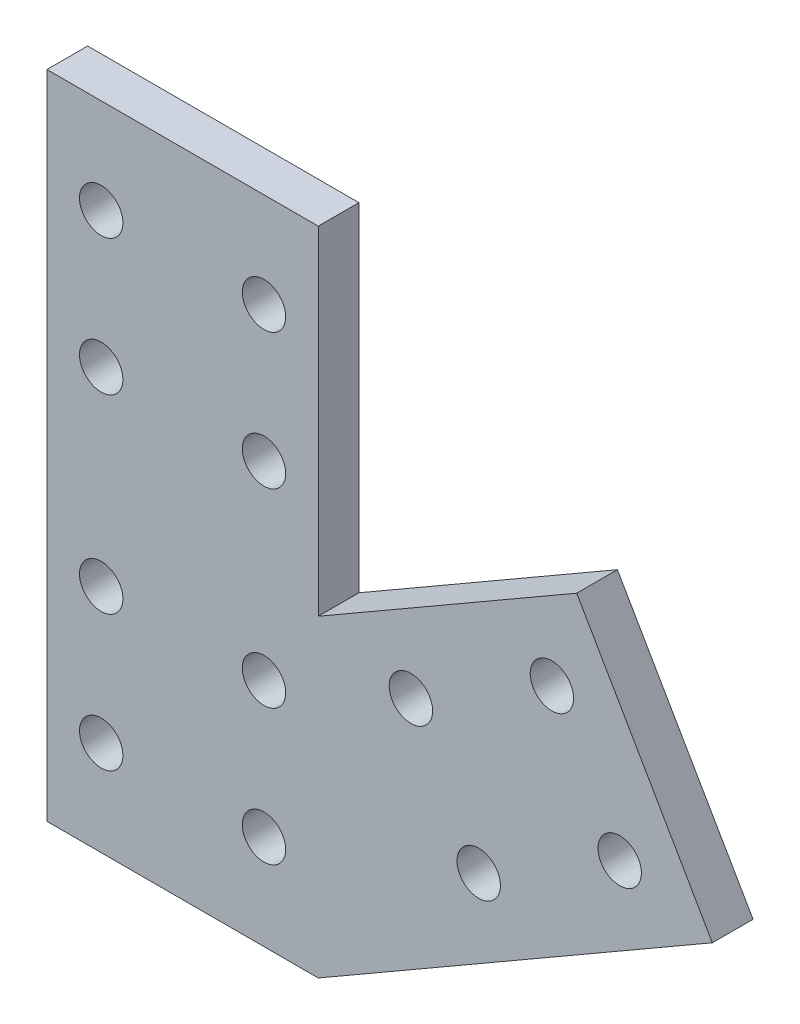
ISO-10303-21;
HEADER;
FILE_DESCRIPTION(('STEP AP214'),'2;1');
FILE_NAME('part.step','',(''),(''),'','','');
FILE_SCHEMA(('AUTOMOTIVE_DESIGN { 1 0 10303 214 1 1 1 1 }'));
ENDSEC;
DATA;
#1=APPLICATION_CONTEXT('core data for automotive mechanical design processes');
#2=APPLICATION_PROTOCOL_DEFINITION('international standard','automotive_design',2000,#1);
#3=PRODUCT_CONTEXT('',#1,'mechanical');
#4=PRODUCT('Part','Part','',(#3));
#5=PRODUCT_RELATED_PRODUCT_CATEGORY('part','',(#4));
#6=PRODUCT_DEFINITION_FORMATION('','',#4);
#7=PRODUCT_DEFINITION_CONTEXT('part definition',#1,'design');
#8=PRODUCT_DEFINITION('design','',#6,#7);
#9=PRODUCT_DEFINITION_SHAPE('','',#8);
#10=(LENGTH_UNIT() NAMED_UNIT(*) SI_UNIT(.MILLI.,.METRE.));
#11=(NAMED_UNIT(*) PLANE_ANGLE_UNIT() SI_UNIT($,.RADIAN.));
#12=(NAMED_UNIT(*) SI_UNIT($,.STERADIAN.) SOLID_ANGLE_UNIT());
#13=UNCERTAINTY_MEASURE_WITH_UNIT(LENGTH_MEASURE(1.E-05),#10,'distance_accuracy_value','');
#14=(GEOMETRIC_REPRESENTATION_CONTEXT(3) GLOBAL_UNCERTAINTY_ASSIGNED_CONTEXT((#13)) GLOBAL_UNIT_ASSIGNED_CONTEXT((#10,
#11,#12)) REPRESENTATION_CONTEXT('',''));
#15=CARTESIAN_POINT('',(0.,0.,0.));
#16=DIRECTION('',(0.,0.,1.));
#17=DIRECTION('',(1.,0.,0.));
#18=AXIS2_PLACEMENT_3D('',#15,#16,#17);
#19=CARTESIAN_POINT('',(0.,48.,3.));
#20=DIRECTION('',(0.,-1.,0.));
#21=DIRECTION('',(0.,0.,-1.));
#22=AXIS2_PLACEMENT_3D('',#19,#20,#21);
#23=PLANE('',#22);
#24=DIRECTION('',(-1.,0.,0.));
#25=VECTOR('',#24,1.);
#26=CARTESIAN_POINT('',(0.,48.,0.));
#27=LINE('',#26,#25);
#28=CARTESIAN_POINT('',(20.,48.,0.));
#29=VERTEX_POINT('',#28);
#30=CARTESIAN_POINT('',(0.,48.,0.));
#31=VERTEX_POINT('',#30);
#32=EDGE_CURVE('E125',#29,#31,#27,.T.);
#33=ORIENTED_EDGE('',*,*,#32,.T.);
#34=DIRECTION('',(0.,0.,-1.));
#35=VECTOR('',#34,1.);
#36=CARTESIAN_POINT('',(0.,48.,3.));
#37=LINE('',#36,#35);
#38=CARTESIAN_POINT('',(0.,48.,3.));
#39=VERTEX_POINT('',#38);
#40=EDGE_CURVE('E11',#39,#31,#37,.T.);
#41=ORIENTED_EDGE('',*,*,#40,.F.);
#42=DIRECTION('',(-1.,0.,0.));
#43=VECTOR('',#42,1.);
#44=CARTESIAN_POINT('',(0.,48.,3.));
#45=LINE('',#44,#43);
#46=CARTESIAN_POINT('',(20.,48.,3.));
#47=VERTEX_POINT('',#46);
#48=EDGE_CURVE('E138',#47,#39,#45,.T.);
#49=ORIENTED_EDGE('',*,*,#48,.F.);
#50=DIRECTION('',(0.,0.,-1.));
#51=VECTOR('',#50,1.);
#52=CARTESIAN_POINT('',(20.,48.,3.));
#53=LINE('',#52,#51);
#54=EDGE_CURVE('E121',#47,#29,#53,.T.);
#55=ORIENTED_EDGE('',*,*,#54,.T.);
#56=EDGE_LOOP('',(#33,#41,#49,#55));
#57=FACE_BOUND('',#56,.T.);
#58=ADVANCED_FACE('F35',(#57),#23,.F.);
#59=CARTESIAN_POINT('',(0.,48.,3.));
#60=DIRECTION('',(1.,0.,0.));
#61=DIRECTION('',(0.,1.,0.));
#62=AXIS2_PLACEMENT_3D('',#59,#60,#61);
#63=PLANE('',#62);
#64=DIRECTION('',(0.,-1.,0.));
#65=VECTOR('',#64,1.);
#66=CARTESIAN_POINT('',(0.,48.,0.));
#67=LINE('',#66,#65);
#68=CARTESIAN_POINT('',(0.,0.,0.));
#69=VERTEX_POINT('',#68);
#70=EDGE_CURVE('E128',#31,#69,#67,.T.);
#71=ORIENTED_EDGE('',*,*,#70,.T.);
#72=DIRECTION('',(0.,0.,-1.));
#73=VECTOR('',#72,1.);
#74=CARTESIAN_POINT('',(0.,0.,3.));
#75=LINE('',#74,#73);
#76=CARTESIAN_POINT('',(0.,0.,3.));
#77=VERTEX_POINT('',#76);
#78=EDGE_CURVE('E43',#77,#69,#75,.T.);
#79=ORIENTED_EDGE('',*,*,#78,.F.);
#80=DIRECTION('',(0.,-1.,0.));
#81=VECTOR('',#80,1.);
#82=CARTESIAN_POINT('',(0.,48.,3.));
#83=LINE('',#82,#81);
#84=EDGE_CURVE('E91',#39,#77,#83,.T.);
#85=ORIENTED_EDGE('',*,*,#84,.F.);
#86=ORIENTED_EDGE('',*,*,#40,.T.);
#87=EDGE_LOOP('',(#71,#79,#85,#86));
#88=FACE_BOUND('',#87,.T.);
#89=ADVANCED_FACE('F281',(#88),#63,.F.);
#90=CARTESIAN_POINT('',(20.,0.,3.));
#91=DIRECTION('',(0.,1.,0.));
#92=DIRECTION('',(-1.,0.,0.));
#93=AXIS2_PLACEMENT_3D('',#90,#91,#92);
#94=PLANE('',#93);
#95=DIRECTION('',(1.,0.,0.));
#96=VECTOR('',#95,1.);
#97=CARTESIAN_POINT('',(20.,0.,0.));
#98=LINE('',#97,#96);
#99=CARTESIAN_POINT('',(20.,0.,0.));
#100=VERTEX_POINT('',#99);
#101=EDGE_CURVE('E131',#69,#100,#98,.T.);
#102=ORIENTED_EDGE('',*,*,#101,.T.);
#103=DIRECTION('',(0.,0.,-1.));
#104=VECTOR('',#103,1.);
#105=CARTESIAN_POINT('',(20.,0.,3.));
#106=LINE('',#105,#104);
#107=CARTESIAN_POINT('',(20.,0.,3.));
#108=VERTEX_POINT('',#107);
#109=EDGE_CURVE('E142',#108,#100,#106,.T.);
#110=ORIENTED_EDGE('',*,*,#109,.F.);
#111=DIRECTION('',(1.,0.,0.));
#112=VECTOR('',#111,1.);
#113=CARTESIAN_POINT('',(20.,0.,3.));
#114=LINE('',#113,#112);
#115=EDGE_CURVE('E150',#77,#108,#114,.T.);
#116=ORIENTED_EDGE('',*,*,#115,.F.);
#117=ORIENTED_EDGE('',*,*,#78,.T.);
#118=EDGE_LOOP('',(#102,#110,#116,#117));
#119=FACE_BOUND('',#118,.T.);
#120=ADVANCED_FACE('F148',(#119),#94,.F.);
#121=CARTESIAN_POINT('',(49.0525588832582,16.7735026918971,3.));
#122=DIRECTION('',(-0.500000000000013,0.866025403784431,0.));
#123=DIRECTION('',(-0.866025403784431,-0.500000000000013,0.));
#124=AXIS2_PLACEMENT_3D('',#121,#122,#123);
#125=PLANE('',#124);
#126=DIRECTION('',(0.866025403784431,0.500000000000013,0.));
#127=VECTOR('',#126,1.);
#128=CARTESIAN_POINT('',(49.0525588832582,16.7735026918971,0.));
#129=LINE('',#128,#127);
#130=CARTESIAN_POINT('',(49.0525588832582,16.7735026918971,0.));
#131=VERTEX_POINT('',#130);
#132=EDGE_CURVE('E133',#100,#131,#129,.T.);
#133=ORIENTED_EDGE('',*,*,#132,.T.);
#134=DIRECTION('',(0.,0.,-1.));
#135=VECTOR('',#134,1.);
#136=CARTESIAN_POINT('',(49.0525588832582,16.7735026918971,3.));
#137=LINE('',#136,#135);
#138=CARTESIAN_POINT('',(49.0525588832582,16.7735026918971,3.));
#139=VERTEX_POINT('',#138);
#140=EDGE_CURVE('E116',#139,#131,#137,.T.);
#141=ORIENTED_EDGE('',*,*,#140,.F.);
#142=DIRECTION('',(0.866025403784431,0.500000000000013,0.));
#143=VECTOR('',#142,1.);
#144=CARTESIAN_POINT('',(49.0525588832582,16.7735026918971,3.));
#145=LINE('',#144,#143);
#146=EDGE_CURVE('E107',#108,#139,#145,.T.);
#147=ORIENTED_EDGE('',*,*,#146,.F.);
#148=ORIENTED_EDGE('',*,*,#109,.T.);
#149=EDGE_LOOP('',(#133,#141,#147,#148));
#150=FACE_BOUND('',#149,.T.);
#151=ADVANCED_FACE('F156',(#150),#125,.F.);
#152=CARTESIAN_POINT('',(39.0525588832576,34.0940107675856,3.));
#153=DIRECTION('',(-0.866025403784422,-0.500000000000028,0.));
#154=DIRECTION('',(0.500000000000028,-0.866025403784422,0.));
#155=AXIS2_PLACEMENT_3D('',#152,#153,#154);
#156=PLANE('',#155);
#157=DIRECTION('',(-0.500000000000028,0.866025403784422,0.));
#158=VECTOR('',#157,1.);
#159=CARTESIAN_POINT('',(39.0525588832576,34.0940107675856,0.));
#160=LINE('',#159,#158);
#161=CARTESIAN_POINT('',(39.0525588832576,34.0940107675856,0.));
#162=VERTEX_POINT('',#161);
#163=EDGE_CURVE('E115',#131,#162,#160,.T.);
#164=ORIENTED_EDGE('',*,*,#163,.T.);
#165=DIRECTION('',(0.,0.,-1.));
#166=VECTOR('',#165,1.);
#167=CARTESIAN_POINT('',(39.0525588832576,34.0940107675856,3.));
#168=LINE('',#167,#166);
#169=CARTESIAN_POINT('',(39.0525588832576,34.0940107675856,3.));
#170=VERTEX_POINT('',#169);
#171=EDGE_CURVE('E112',#170,#162,#168,.T.);
#172=ORIENTED_EDGE('',*,*,#171,.F.);
#173=DIRECTION('',(-0.500000000000028,0.866025403784422,0.));
#174=VECTOR('',#173,1.);
#175=CARTESIAN_POINT('',(39.0525588832576,34.0940107675856,3.));
#176=LINE('',#175,#174);
#177=EDGE_CURVE('E101',#139,#170,#176,.T.);
#178=ORIENTED_EDGE('',*,*,#177,.F.);
#179=ORIENTED_EDGE('',*,*,#140,.T.);
#180=EDGE_LOOP('',(#164,#172,#178,#179));
#181=FACE_BOUND('',#180,.T.);
#182=ADVANCED_FACE('F113',(#181),#156,.F.);
#183=CARTESIAN_POINT('',(20.,23.0940107675855,3.));
#184=DIRECTION('',(0.500000000000004,-0.866025403784436,0.));
#185=DIRECTION('',(0.866025403784436,0.500000000000004,0.));
#186=AXIS2_PLACEMENT_3D('',#183,#184,#185);
#187=PLANE('',#186);
#188=DIRECTION('',(-0.866025403784436,-0.500000000000004,0.));
#189=VECTOR('',#188,1.);
#190=CARTESIAN_POINT('',(20.,23.0940107675855,0.));
#191=LINE('',#190,#189);
#192=CARTESIAN_POINT('',(20.,23.0940107675855,0.));
#193=VERTEX_POINT('',#192);
#194=EDGE_CURVE('E77',#162,#193,#191,.T.);
#195=ORIENTED_EDGE('',*,*,#194,.T.);
#196=DIRECTION('',(0.,0.,-1.));
#197=VECTOR('',#196,1.);
#198=CARTESIAN_POINT('',(20.,23.0940107675855,3.));
#199=LINE('',#198,#197);
#200=CARTESIAN_POINT('',(20.,23.0940107675855,3.));
#201=VERTEX_POINT('',#200);
#202=EDGE_CURVE('E117',#201,#193,#199,.T.);
#203=ORIENTED_EDGE('',*,*,#202,.F.);
#204=DIRECTION('',(-0.866025403784436,-0.500000000000004,0.));
#205=VECTOR('',#204,1.);
#206=CARTESIAN_POINT('',(20.,23.0940107675855,3.));
#207=LINE('',#206,#205);
#208=EDGE_CURVE('E105',#170,#201,#207,.T.);
#209=ORIENTED_EDGE('',*,*,#208,.F.);
#210=ORIENTED_EDGE('',*,*,#171,.T.);
#211=EDGE_LOOP('',(#195,#203,#209,#210));
#212=FACE_BOUND('',#211,.T.);
#213=ADVANCED_FACE('F119',(#212),#187,.F.);
#214=CARTESIAN_POINT('',(20.,48.,3.));
#215=DIRECTION('',(-1.,0.,0.));
#216=DIRECTION('',(0.,-1.,0.));
#217=AXIS2_PLACEMENT_3D('',#214,#215,#216);
#218=PLANE('',#217);
#219=DIRECTION('',(0.,1.,0.));
#220=VECTOR('',#219,1.);
#221=CARTESIAN_POINT('',(20.,48.,0.));
#222=LINE('',#221,#220);
#223=EDGE_CURVE('E83',#193,#29,#222,.T.);
#224=ORIENTED_EDGE('',*,*,#223,.T.);
#225=ORIENTED_EDGE('',*,*,#54,.F.);
#226=DIRECTION('',(0.,1.,0.));
#227=VECTOR('',#226,1.);
#228=CARTESIAN_POINT('',(20.,48.,3.));
#229=LINE('',#228,#227);
#230=EDGE_CURVE('E51',#201,#47,#229,.T.);
#231=ORIENTED_EDGE('',*,*,#230,.F.);
#232=ORIENTED_EDGE('',*,*,#202,.T.);
#233=EDGE_LOOP('',(#224,#225,#231,#232));
#234=FACE_BOUND('',#233,.T.);
#235=ADVANCED_FACE('F288',(#234),#218,.F.);
#236=CARTESIAN_POINT('',(0.,0.,3.));
#237=DIRECTION('',(0.,0.,-1.));
#238=DIRECTION('',(-1.,0.,0.));
#239=AXIS2_PLACEMENT_3D('',#236,#237,#238);
#240=PLANE('',#239);
#241=CARTESIAN_POINT('',(42.222431864336,18.6036297108193,3.));
#242=DIRECTION('',(0.,0.,-1.));
#243=DIRECTION('',(-1.,0.,0.));
#244=AXIS2_PLACEMENT_3D('',#241,#242,#243);
#245=CIRCLE('',#244,1.6);
#246=CARTESIAN_POINT('',(40.622431864336,18.6036297108193,3.));
#247=VERTEX_POINT('',#246);
#248=EDGE_CURVE('E129',#247,#247,#245,.T.);
#249=ORIENTED_EDGE('',*,*,#248,.T.);
#250=EDGE_LOOP('',(#249));
#251=FACE_BOUND('',#250,.T.);
#252=CARTESIAN_POINT('',(16.,41.,3.));
#253=DIRECTION('',(0.,0.,-1.));
#254=DIRECTION('',(-1.,0.,0.));
#255=AXIS2_PLACEMENT_3D('',#252,#253,#254);
#256=CIRCLE('',#255,1.6);
#257=CARTESIAN_POINT('',(14.4,41.,3.));
#258=VERTEX_POINT('',#257);
#259=EDGE_CURVE('E203',#258,#258,#256,.T.);
#260=ORIENTED_EDGE('',*,*,#259,.T.);
#261=EDGE_LOOP('',(#260));
#262=FACE_BOUND('',#261,.T.);
#263=CARTESIAN_POINT('',(4.,31.,3.));
#264=DIRECTION('',(0.,0.,-1.));
#265=DIRECTION('',(-1.,0.,0.));
#266=AXIS2_PLACEMENT_3D('',#263,#264,#265);
#267=CIRCLE('',#266,1.6);
#268=CARTESIAN_POINT('',(2.4,31.,3.));
#269=VERTEX_POINT('',#268);
#270=EDGE_CURVE('E214',#269,#269,#267,.T.);
#271=ORIENTED_EDGE('',*,*,#270,.T.);
#272=EDGE_LOOP('',(#271));
#273=FACE_BOUND('',#272,.T.);
#274=CARTESIAN_POINT('',(4.,41.,3.));
#275=DIRECTION('',(0.,0.,-1.));
#276=DIRECTION('',(-1.,0.,0.));
#277=AXIS2_PLACEMENT_3D('',#274,#275,#276);
#278=CIRCLE('',#277,1.6);
#279=CARTESIAN_POINT('',(2.4,41.,3.));
#280=VERTEX_POINT('',#279);
#281=EDGE_CURVE('E215',#280,#280,#278,.T.);
#282=ORIENTED_EDGE('',*,*,#281,.T.);
#283=EDGE_LOOP('',(#282));
#284=FACE_BOUND('',#283,.T.);
#285=CARTESIAN_POINT('',(37.222431864336,27.2638837486637,3.));
#286=DIRECTION('',(0.,0.,-1.));
#287=DIRECTION('',(-1.,0.,0.));
#288=AXIS2_PLACEMENT_3D('',#285,#286,#287);
#289=CIRCLE('',#288,1.6);
#290=CARTESIAN_POINT('',(35.622431864336,27.2638837486637,3.));
#291=VERTEX_POINT('',#290);
#292=EDGE_CURVE('E183',#291,#291,#289,.T.);
#293=ORIENTED_EDGE('',*,*,#292,.T.);
#294=EDGE_LOOP('',(#293));
#295=FACE_BOUND('',#294,.T.);
#296=CARTESIAN_POINT('',(26.8301270189227,21.2638837486637,3.));
#297=DIRECTION('',(0.,0.,-1.));
#298=DIRECTION('',(-1.,0.,0.));
#299=AXIS2_PLACEMENT_3D('',#296,#297,#298);
#300=CIRCLE('',#299,1.6);
#301=CARTESIAN_POINT('',(25.2301270189227,21.2638837486637,3.));
#302=VERTEX_POINT('',#301);
#303=EDGE_CURVE('E177',#302,#302,#300,.T.);
#304=ORIENTED_EDGE('',*,*,#303,.T.);
#305=EDGE_LOOP('',(#304));
#306=FACE_BOUND('',#305,.T.);
#307=CARTESIAN_POINT('',(31.8301270189227,12.6036297108193,3.));
#308=DIRECTION('',(0.,0.,-1.));
#309=DIRECTION('',(-1.,0.,0.));
#310=AXIS2_PLACEMENT_3D('',#307,#308,#309);
#311=CIRCLE('',#310,1.6);
#312=CARTESIAN_POINT('',(30.2301270189227,12.6036297108193,3.));
#313=VERTEX_POINT('',#312);
#314=EDGE_CURVE('E171',#313,#313,#311,.T.);
#315=ORIENTED_EDGE('',*,*,#314,.T.);
#316=EDGE_LOOP('',(#315));
#317=FACE_BOUND('',#316,.T.);
#318=CARTESIAN_POINT('',(16.,7.,3.));
#319=DIRECTION('',(0.,0.,-1.));
#320=DIRECTION('',(-1.,0.,0.));
#321=AXIS2_PLACEMENT_3D('',#318,#319,#320);
#322=CIRCLE('',#321,1.6);
#323=CARTESIAN_POINT('',(14.4,7.,3.));
#324=VERTEX_POINT('',#323);
#325=EDGE_CURVE('E164',#324,#324,#322,.T.);
#326=ORIENTED_EDGE('',*,*,#325,.T.);
#327=EDGE_LOOP('',(#326));
#328=FACE_BOUND('',#327,.T.);
#329=CARTESIAN_POINT('',(16.,31.,3.));
#330=DIRECTION('',(0.,0.,-1.));
#331=DIRECTION('',(-1.,0.,0.));
#332=AXIS2_PLACEMENT_3D('',#329,#330,#331);
#333=CIRCLE('',#332,1.6);
#334=CARTESIAN_POINT('',(14.4,31.,3.));
#335=VERTEX_POINT('',#334);
#336=EDGE_CURVE('E202',#335,#335,#333,.T.);
#337=ORIENTED_EDGE('',*,*,#336,.T.);
#338=EDGE_LOOP('',(#337));
#339=FACE_BOUND('',#338,.T.);
#340=CARTESIAN_POINT('',(4.,17.,3.));
#341=DIRECTION('',(0.,0.,-1.));
#342=DIRECTION('',(-1.,0.,0.));
#343=AXIS2_PLACEMENT_3D('',#340,#341,#342);
#344=CIRCLE('',#343,1.6);
#345=CARTESIAN_POINT('',(2.4,17.,3.));
#346=VERTEX_POINT('',#345);
#347=EDGE_CURVE('E191',#346,#346,#344,.T.);
#348=ORIENTED_EDGE('',*,*,#347,.T.);
#349=EDGE_LOOP('',(#348));
#350=FACE_BOUND('',#349,.T.);
#351=CARTESIAN_POINT('',(4.,7.,3.));
#352=DIRECTION('',(0.,0.,-1.));
#353=DIRECTION('',(-1.,0.,0.));
#354=AXIS2_PLACEMENT_3D('',#351,#352,#353);
#355=CIRCLE('',#354,1.6);
#356=CARTESIAN_POINT('',(2.4,7.,3.));
#357=VERTEX_POINT('',#356);
#358=EDGE_CURVE('E190',#357,#357,#355,.T.);
#359=ORIENTED_EDGE('',*,*,#358,.T.);
#360=EDGE_LOOP('',(#359));
#361=FACE_BOUND('',#360,.T.);
#362=CARTESIAN_POINT('',(16.,17.,3.));
#363=DIRECTION('',(0.,0.,-1.));
#364=DIRECTION('',(-1.,0.,0.));
#365=AXIS2_PLACEMENT_3D('',#362,#363,#364);
#366=CIRCLE('',#365,1.6);
#367=CARTESIAN_POINT('',(14.4,17.,3.));
#368=VERTEX_POINT('',#367);
#369=EDGE_CURVE('E165',#368,#368,#366,.T.);
#370=ORIENTED_EDGE('',*,*,#369,.T.);
#371=EDGE_LOOP('',(#370));
#372=FACE_BOUND('',#371,.T.);
#373=ORIENTED_EDGE('',*,*,#48,.T.);
#374=ORIENTED_EDGE('',*,*,#84,.T.);
#375=ORIENTED_EDGE('',*,*,#115,.T.);
#376=ORIENTED_EDGE('',*,*,#146,.T.);
#377=ORIENTED_EDGE('',*,*,#177,.T.);
#378=ORIENTED_EDGE('',*,*,#208,.T.);
#379=ORIENTED_EDGE('',*,*,#230,.T.);
#380=EDGE_LOOP('',(#373,#374,#375,#376,#377,#378,#379));
#381=FACE_BOUND('',#380,.T.);
#382=ADVANCED_FACE('F103',(#251,#262,#273,#284,#295,#306,#317,#328,#339,#350,#361,#372,#381),
#240,.F.);
#383=CARTESIAN_POINT('',(0.,0.,0.));
#384=DIRECTION('',(0.,0.,-1.));
#385=DIRECTION('',(-1.,0.,0.));
#386=AXIS2_PLACEMENT_3D('',#383,#384,#385);
#387=PLANE('',#386);
#388=CARTESIAN_POINT('',(42.222431864336,18.6036297108193,0.));
#389=DIRECTION('',(0.,0.,-1.));
#390=DIRECTION('',(-1.,0.,0.));
#391=AXIS2_PLACEMENT_3D('',#388,#389,#390);
#392=CIRCLE('',#391,1.6);
#393=CARTESIAN_POINT('',(40.622431864336,18.6036297108193,0.));
#394=VERTEX_POINT('',#393);
#395=EDGE_CURVE('E186',#394,#394,#392,.T.);
#396=ORIENTED_EDGE('',*,*,#395,.F.);
#397=EDGE_LOOP('',(#396));
#398=FACE_BOUND('',#397,.T.);
#399=CARTESIAN_POINT('',(16.,41.,0.));
#400=DIRECTION('',(0.,0.,-1.));
#401=DIRECTION('',(-1.,0.,0.));
#402=AXIS2_PLACEMENT_3D('',#399,#400,#401);
#403=CIRCLE('',#402,1.6);
#404=CARTESIAN_POINT('',(14.4,41.,0.));
#405=VERTEX_POINT('',#404);
#406=EDGE_CURVE('E218',#405,#405,#403,.T.);
#407=ORIENTED_EDGE('',*,*,#406,.F.);
#408=EDGE_LOOP('',(#407));
#409=FACE_BOUND('',#408,.T.);
#410=CARTESIAN_POINT('',(4.,31.,0.));
#411=DIRECTION('',(0.,0.,-1.));
#412=DIRECTION('',(-1.,0.,0.));
#413=AXIS2_PLACEMENT_3D('',#410,#411,#412);
#414=CIRCLE('',#413,1.6);
#415=CARTESIAN_POINT('',(2.4,31.,0.));
#416=VERTEX_POINT('',#415);
#417=EDGE_CURVE('E211',#416,#416,#414,.T.);
#418=ORIENTED_EDGE('',*,*,#417,.F.);
#419=EDGE_LOOP('',(#418));
#420=FACE_BOUND('',#419,.T.);
#421=CARTESIAN_POINT('',(4.,41.,0.));
#422=DIRECTION('',(0.,0.,-1.));
#423=DIRECTION('',(-1.,0.,0.));
#424=AXIS2_PLACEMENT_3D('',#421,#422,#423);
#425=CIRCLE('',#424,1.6);
#426=CARTESIAN_POINT('',(2.4,41.,0.));
#427=VERTEX_POINT('',#426);
#428=EDGE_CURVE('E223',#427,#427,#425,.T.);
#429=ORIENTED_EDGE('',*,*,#428,.F.);
#430=EDGE_LOOP('',(#429));
#431=FACE_BOUND('',#430,.T.);
#432=CARTESIAN_POINT('',(37.222431864336,27.2638837486637,0.));
#433=DIRECTION('',(0.,0.,-1.));
#434=DIRECTION('',(-1.,0.,0.));
#435=AXIS2_PLACEMENT_3D('',#432,#433,#434);
#436=CIRCLE('',#435,1.6);
#437=CARTESIAN_POINT('',(35.622431864336,27.2638837486637,0.));
#438=VERTEX_POINT('',#437);
#439=EDGE_CURVE('E180',#438,#438,#436,.T.);
#440=ORIENTED_EDGE('',*,*,#439,.F.);
#441=EDGE_LOOP('',(#440));
#442=FACE_BOUND('',#441,.T.);
#443=CARTESIAN_POINT('',(26.8301270189227,21.2638837486637,0.));
#444=DIRECTION('',(0.,0.,-1.));
#445=DIRECTION('',(-1.,0.,0.));
#446=AXIS2_PLACEMENT_3D('',#443,#444,#445);
#447=CIRCLE('',#446,1.6);
#448=CARTESIAN_POINT('',(25.2301270189227,21.2638837486637,0.));
#449=VERTEX_POINT('',#448);
#450=EDGE_CURVE('E174',#449,#449,#447,.T.);
#451=ORIENTED_EDGE('',*,*,#450,.F.);
#452=EDGE_LOOP('',(#451));
#453=FACE_BOUND('',#452,.T.);
#454=CARTESIAN_POINT('',(31.8301270189227,12.6036297108193,0.));
#455=DIRECTION('',(0.,0.,-1.));
#456=DIRECTION('',(-1.,0.,0.));
#457=AXIS2_PLACEMENT_3D('',#454,#455,#456);
#458=CIRCLE('',#457,1.6);
#459=CARTESIAN_POINT('',(30.2301270189227,12.6036297108193,0.));
#460=VERTEX_POINT('',#459);
#461=EDGE_CURVE('E168',#460,#460,#458,.T.);
#462=ORIENTED_EDGE('',*,*,#461,.F.);
#463=EDGE_LOOP('',(#462));
#464=FACE_BOUND('',#463,.T.);
#465=CARTESIAN_POINT('',(16.,7.,0.));
#466=DIRECTION('',(0.,0.,-1.));
#467=DIRECTION('',(-1.,0.,0.));
#468=AXIS2_PLACEMENT_3D('',#465,#466,#467);
#469=CIRCLE('',#468,1.6);
#470=CARTESIAN_POINT('',(14.4,7.,0.));
#471=VERTEX_POINT('',#470);
#472=EDGE_CURVE('E161',#471,#471,#469,.T.);
#473=ORIENTED_EDGE('',*,*,#472,.F.);
#474=EDGE_LOOP('',(#473));
#475=FACE_BOUND('',#474,.T.);
#476=CARTESIAN_POINT('',(16.,31.,0.));
#477=DIRECTION('',(0.,0.,-1.));
#478=DIRECTION('',(-1.,0.,0.));
#479=AXIS2_PLACEMENT_3D('',#476,#477,#478);
#480=CIRCLE('',#479,1.6);
#481=CARTESIAN_POINT('',(14.4,31.,0.));
#482=VERTEX_POINT('',#481);
#483=EDGE_CURVE('E199',#482,#482,#480,.T.);
#484=ORIENTED_EDGE('',*,*,#483,.F.);
#485=EDGE_LOOP('',(#484));
#486=FACE_BOUND('',#485,.T.);
#487=CARTESIAN_POINT('',(4.,17.,0.));
#488=DIRECTION('',(0.,0.,-1.));
#489=DIRECTION('',(-1.,0.,0.));
#490=AXIS2_PLACEMENT_3D('',#487,#488,#489);
#491=CIRCLE('',#490,1.6);
#492=CARTESIAN_POINT('',(2.4,17.,0.));
#493=VERTEX_POINT('',#492);
#494=EDGE_CURVE('E206',#493,#493,#491,.T.);
#495=ORIENTED_EDGE('',*,*,#494,.F.);
#496=EDGE_LOOP('',(#495));
#497=FACE_BOUND('',#496,.T.);
#498=CARTESIAN_POINT('',(4.,7.,0.));
#499=DIRECTION('',(0.,0.,-1.));
#500=DIRECTION('',(-1.,0.,0.));
#501=AXIS2_PLACEMENT_3D('',#498,#499,#500);
#502=CIRCLE('',#501,1.6);
#503=CARTESIAN_POINT('',(2.4,7.,0.));
#504=VERTEX_POINT('',#503);
#505=EDGE_CURVE('E187',#504,#504,#502,.T.);
#506=ORIENTED_EDGE('',*,*,#505,.F.);
#507=EDGE_LOOP('',(#506));
#508=FACE_BOUND('',#507,.T.);
#509=CARTESIAN_POINT('',(16.,17.,0.));
#510=DIRECTION('',(0.,0.,-1.));
#511=DIRECTION('',(-1.,0.,0.));
#512=AXIS2_PLACEMENT_3D('',#509,#510,#511);
#513=CIRCLE('',#512,1.6);
#514=CARTESIAN_POINT('',(14.4,17.,0.));
#515=VERTEX_POINT('',#514);
#516=EDGE_CURVE('E194',#515,#515,#513,.T.);
#517=ORIENTED_EDGE('',*,*,#516,.F.);
#518=EDGE_LOOP('',(#517));
#519=FACE_BOUND('',#518,.T.);
#520=ORIENTED_EDGE('',*,*,#32,.F.);
#521=ORIENTED_EDGE('',*,*,#223,.F.);
#522=ORIENTED_EDGE('',*,*,#194,.F.);
#523=ORIENTED_EDGE('',*,*,#163,.F.);
#524=ORIENTED_EDGE('',*,*,#132,.F.);
#525=ORIENTED_EDGE('',*,*,#101,.F.);
#526=ORIENTED_EDGE('',*,*,#70,.F.);
#527=EDGE_LOOP('',(#520,#521,#522,#523,#524,#525,#526));
#528=FACE_BOUND('',#527,.T.);
#529=ADVANCED_FACE('F154',(#398,#409,#420,#431,#442,#453,#464,#475,#486,#497,#508,#519,#528),
#387,.T.);
#530=CARTESIAN_POINT('',(16.,17.,3.));
#531=DIRECTION('',(0.,0.,-1.));
#532=DIRECTION('',(-1.,0.,0.));
#533=AXIS2_PLACEMENT_3D('',#530,#531,#532);
#534=CYLINDRICAL_SURFACE('',#533,1.6);
#535=ORIENTED_EDGE('',*,*,#369,.F.);
#536=EDGE_LOOP('',(#535));
#537=FACE_BOUND('',#536,.T.);
#538=ORIENTED_EDGE('',*,*,#516,.T.);
#539=EDGE_LOOP('',(#538));
#540=FACE_BOUND('',#539,.T.);
#541=ADVANCED_FACE('F244',(#537,#540),#534,.F.);
#542=CARTESIAN_POINT('',(4.,7.,3.));
#543=DIRECTION('',(0.,0.,-1.));
#544=DIRECTION('',(-1.,0.,0.));
#545=AXIS2_PLACEMENT_3D('',#542,#543,#544);
#546=CYLINDRICAL_SURFACE('',#545,1.6);
#547=ORIENTED_EDGE('',*,*,#358,.F.);
#548=EDGE_LOOP('',(#547));
#549=FACE_BOUND('',#548,.T.);
#550=ORIENTED_EDGE('',*,*,#505,.T.);
#551=EDGE_LOOP('',(#550));
#552=FACE_BOUND('',#551,.T.);
#553=ADVANCED_FACE('F269',(#549,#552),#546,.F.);
#554=CARTESIAN_POINT('',(4.,17.,3.));
#555=DIRECTION('',(0.,0.,-1.));
#556=DIRECTION('',(-1.,0.,0.));
#557=AXIS2_PLACEMENT_3D('',#554,#555,#556);
#558=CYLINDRICAL_SURFACE('',#557,1.6);
#559=ORIENTED_EDGE('',*,*,#347,.F.);
#560=EDGE_LOOP('',(#559));
#561=FACE_BOUND('',#560,.T.);
#562=ORIENTED_EDGE('',*,*,#494,.T.);
#563=EDGE_LOOP('',(#562));
#564=FACE_BOUND('',#563,.T.);
#565=ADVANCED_FACE('F275',(#561,#564),#558,.F.);
#566=CARTESIAN_POINT('',(16.,31.,3.));
#567=DIRECTION('',(0.,0.,-1.));
#568=DIRECTION('',(-1.,0.,0.));
#569=AXIS2_PLACEMENT_3D('',#566,#567,#568);
#570=CYLINDRICAL_SURFACE('',#569,1.6);
#571=ORIENTED_EDGE('',*,*,#336,.F.);
#572=EDGE_LOOP('',(#571));
#573=FACE_BOUND('',#572,.T.);
#574=ORIENTED_EDGE('',*,*,#483,.T.);
#575=EDGE_LOOP('',(#574));
#576=FACE_BOUND('',#575,.T.);
#577=ADVANCED_FACE('F354',(#573,#576),#570,.F.);
#578=CARTESIAN_POINT('',(16.,7.,3.));
#579=DIRECTION('',(0.,0.,-1.));
#580=DIRECTION('',(-1.,0.,0.));
#581=AXIS2_PLACEMENT_3D('',#578,#579,#580);
#582=CYLINDRICAL_SURFACE('',#581,1.6);
#583=ORIENTED_EDGE('',*,*,#325,.F.);
#584=EDGE_LOOP('',(#583));
#585=FACE_BOUND('',#584,.T.);
#586=ORIENTED_EDGE('',*,*,#472,.T.);
#587=EDGE_LOOP('',(#586));
#588=FACE_BOUND('',#587,.T.);
#589=ADVANCED_FACE('F364',(#585,#588),#582,.F.);
#590=CARTESIAN_POINT('',(31.8301270189227,12.6036297108193,3.));
#591=DIRECTION('',(0.,0.,-1.));
#592=DIRECTION('',(-1.,0.,0.));
#593=AXIS2_PLACEMENT_3D('',#590,#591,#592);
#594=CYLINDRICAL_SURFACE('',#593,1.6);
#595=ORIENTED_EDGE('',*,*,#314,.F.);
#596=EDGE_LOOP('',(#595));
#597=FACE_BOUND('',#596,.T.);
#598=ORIENTED_EDGE('',*,*,#461,.T.);
#599=EDGE_LOOP('',(#598));
#600=FACE_BOUND('',#599,.T.);
#601=ADVANCED_FACE('F373',(#597,#600),#594,.F.);
#602=CARTESIAN_POINT('',(26.8301270189227,21.2638837486637,3.));
#603=DIRECTION('',(0.,0.,-1.));
#604=DIRECTION('',(-1.,0.,0.));
#605=AXIS2_PLACEMENT_3D('',#602,#603,#604);
#606=CYLINDRICAL_SURFACE('',#605,1.6);
#607=ORIENTED_EDGE('',*,*,#303,.F.);
#608=EDGE_LOOP('',(#607));
#609=FACE_BOUND('',#608,.T.);
#610=ORIENTED_EDGE('',*,*,#450,.T.);
#611=EDGE_LOOP('',(#610));
#612=FACE_BOUND('',#611,.T.);
#613=ADVANCED_FACE('F383',(#609,#612),#606,.F.);
#614=CARTESIAN_POINT('',(37.222431864336,27.2638837486637,3.));
#615=DIRECTION('',(0.,0.,-1.));
#616=DIRECTION('',(-1.,0.,0.));
#617=AXIS2_PLACEMENT_3D('',#614,#615,#616);
#618=CYLINDRICAL_SURFACE('',#617,1.6);
#619=ORIENTED_EDGE('',*,*,#292,.F.);
#620=EDGE_LOOP('',(#619));
#621=FACE_BOUND('',#620,.T.);
#622=ORIENTED_EDGE('',*,*,#439,.T.);
#623=EDGE_LOOP('',(#622));
#624=FACE_BOUND('',#623,.T.);
#625=ADVANCED_FACE('F393',(#621,#624),#618,.F.);
#626=CARTESIAN_POINT('',(4.,41.,3.));
#627=DIRECTION('',(0.,0.,-1.));
#628=DIRECTION('',(-1.,0.,0.));
#629=AXIS2_PLACEMENT_3D('',#626,#627,#628);
#630=CYLINDRICAL_SURFACE('',#629,1.6);
#631=ORIENTED_EDGE('',*,*,#281,.F.);
#632=EDGE_LOOP('',(#631));
#633=FACE_BOUND('',#632,.T.);
#634=ORIENTED_EDGE('',*,*,#428,.T.);
#635=EDGE_LOOP('',(#634));
#636=FACE_BOUND('',#635,.T.);
#637=ADVANCED_FACE('F403',(#633,#636),#630,.F.);
#638=CARTESIAN_POINT('',(4.,31.,3.));
#639=DIRECTION('',(0.,0.,-1.));
#640=DIRECTION('',(-1.,0.,0.));
#641=AXIS2_PLACEMENT_3D('',#638,#639,#640);
#642=CYLINDRICAL_SURFACE('',#641,1.6);
#643=ORIENTED_EDGE('',*,*,#270,.F.);
#644=EDGE_LOOP('',(#643));
#645=FACE_BOUND('',#644,.T.);
#646=ORIENTED_EDGE('',*,*,#417,.T.);
#647=EDGE_LOOP('',(#646));
#648=FACE_BOUND('',#647,.T.);
#649=ADVANCED_FACE('F413',(#645,#648),#642,.F.);
#650=CARTESIAN_POINT('',(16.,41.,3.));
#651=DIRECTION('',(0.,0.,-1.));
#652=DIRECTION('',(-1.,0.,0.));
#653=AXIS2_PLACEMENT_3D('',#650,#651,#652);
#654=CYLINDRICAL_SURFACE('',#653,1.6);
#655=ORIENTED_EDGE('',*,*,#259,.F.);
#656=EDGE_LOOP('',(#655));
#657=FACE_BOUND('',#656,.T.);
#658=ORIENTED_EDGE('',*,*,#406,.T.);
#659=EDGE_LOOP('',(#658));
#660=FACE_BOUND('',#659,.T.);
#661=ADVANCED_FACE('F238',(#657,#660),#654,.F.);
#662=CARTESIAN_POINT('',(42.222431864336,18.6036297108193,3.));
#663=DIRECTION('',(0.,0.,-1.));
#664=DIRECTION('',(-1.,0.,0.));
#665=AXIS2_PLACEMENT_3D('',#662,#663,#664);
#666=CYLINDRICAL_SURFACE('',#665,1.6);
#667=ORIENTED_EDGE('',*,*,#248,.F.);
#668=EDGE_LOOP('',(#667));
#669=FACE_BOUND('',#668,.T.);
#670=ORIENTED_EDGE('',*,*,#395,.T.);
#671=EDGE_LOOP('',(#670));
#672=FACE_BOUND('',#671,.T.);
#673=ADVANCED_FACE('F235',(#669,#672),#666,.F.);
#674=CLOSED_SHELL('',(#58,#89,#120,#151,#182,#213,#235,#382,#529,#541,#553,#565,#577,#589,#601,
#613,#625,#637,#649,#661,#673));
#675=MANIFOLD_SOLID_BREP('B2',#674);
#676=ADVANCED_BREP_SHAPE_REPRESENTATION('',(#18,#675),#14);
#677=SHAPE_DEFINITION_REPRESENTATION(#9,#676);
ENDSEC;
END-ISO-10303-21;
